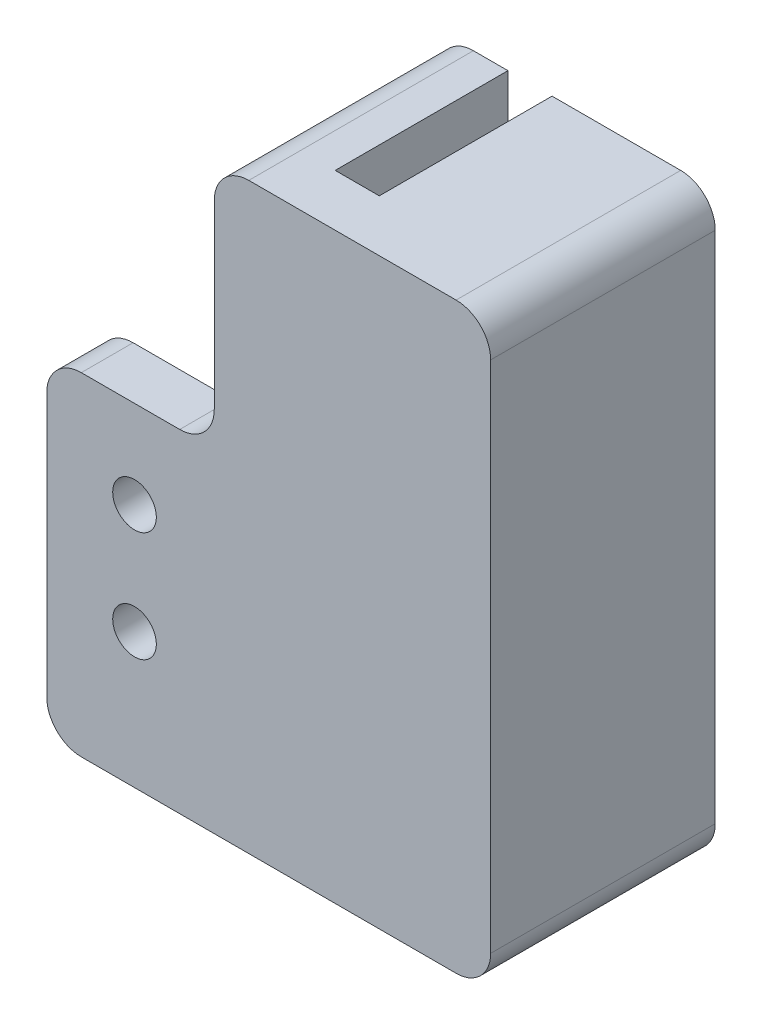
ISO-10303-21;
HEADER;
FILE_DESCRIPTION(('STEP AP214'),'2;1');
FILE_NAME('part.step','',(''),(''),'','','');
FILE_SCHEMA(('AUTOMOTIVE_DESIGN { 1 0 10303 214 1 1 1 1 }'));
ENDSEC;
DATA;
#1=APPLICATION_CONTEXT('core data for automotive mechanical design processes');
#2=APPLICATION_PROTOCOL_DEFINITION('international standard','automotive_design',2000,#1);
#3=PRODUCT_CONTEXT('',#1,'mechanical');
#4=PRODUCT('Part','Part','',(#3));
#5=PRODUCT_RELATED_PRODUCT_CATEGORY('part','',(#4));
#6=PRODUCT_DEFINITION_FORMATION('','',#4);
#7=PRODUCT_DEFINITION_CONTEXT('part definition',#1,'design');
#8=PRODUCT_DEFINITION('design','',#6,#7);
#9=PRODUCT_DEFINITION_SHAPE('','',#8);
#10=(LENGTH_UNIT() NAMED_UNIT(*) SI_UNIT(.MILLI.,.METRE.));
#11=(NAMED_UNIT(*) PLANE_ANGLE_UNIT() SI_UNIT($,.RADIAN.));
#12=(NAMED_UNIT(*) SI_UNIT($,.STERADIAN.) SOLID_ANGLE_UNIT());
#13=UNCERTAINTY_MEASURE_WITH_UNIT(LENGTH_MEASURE(1.E-05),#10,'distance_accuracy_value','');
#14=(GEOMETRIC_REPRESENTATION_CONTEXT(3) GLOBAL_UNCERTAINTY_ASSIGNED_CONTEXT((#13)) GLOBAL_UNIT_ASSIGNED_CONTEXT((#10,
#11,#12)) REPRESENTATION_CONTEXT('',''));
#15=CARTESIAN_POINT('',(0.,0.,0.));
#16=DIRECTION('',(0.,0.,1.));
#17=DIRECTION('',(1.,0.,0.));
#18=AXIS2_PLACEMENT_3D('',#15,#16,#17);
#19=CARTESIAN_POINT('',(0.,0.,20.));
#20=DIRECTION('',(0.,0.,-1.));
#21=DIRECTION('',(-1.,0.,0.));
#22=AXIS2_PLACEMENT_3D('',#19,#20,#21);
#23=PLANE('',#22);
#24=CARTESIAN_POINT('',(510.767604335457,28.3661978322714,20.));
#25=DIRECTION('',(0.,0.,-1.));
#26=DIRECTION('',(-1.,0.,0.));
#27=AXIS2_PLACEMENT_3D('',#24,#25,#26);
#28=CIRCLE('',#27,2.52499999999998);
#29=CARTESIAN_POINT('',(508.242604335457,28.3661978322714,20.));
#30=VERTEX_POINT('',#29);
#31=EDGE_CURVE('E256',#30,#30,#28,.T.);
#32=ORIENTED_EDGE('',*,*,#31,.F.);
#33=EDGE_LOOP('',(#32));
#34=FACE_BOUND('',#33,.T.);
#35=CARTESIAN_POINT('',(510.767604335457,15.6361978322714,20.));
#36=DIRECTION('',(0.,0.,-1.));
#37=DIRECTION('',(-1.,0.,0.));
#38=AXIS2_PLACEMENT_3D('',#35,#36,#37);
#39=CIRCLE('',#38,2.52499999999998);
#40=CARTESIAN_POINT('',(508.242604335457,15.6361978322714,20.));
#41=VERTEX_POINT('',#40);
#42=EDGE_CURVE('E251',#41,#41,#39,.T.);
#43=ORIENTED_EDGE('',*,*,#42,.F.);
#44=EDGE_LOOP('',(#43));
#45=FACE_BOUND('',#44,.T.);
#46=DIRECTION('',(-1.,0.,0.));
#47=VECTOR('',#46,1.);
#48=CARTESIAN_POINT('',(533.107604335457,0.,20.));
#49=LINE('',#48,#47);
#50=CARTESIAN_POINT('',(524.,0.,20.));
#51=VERTEX_POINT('',#50);
#52=CARTESIAN_POINT('',(504.607604335457,0.,20.));
#53=VERTEX_POINT('',#52);
#54=EDGE_CURVE('E267',#51,#53,#49,.T.);
#55=ORIENTED_EDGE('',*,*,#54,.T.);
#56=CARTESIAN_POINT('',(504.607604335457,4.,20.));
#57=DIRECTION('',(0.,0.,-1.));
#58=DIRECTION('',(-1.,0.,0.));
#59=AXIS2_PLACEMENT_3D('',#56,#57,#58);
#60=CIRCLE('',#59,4.);
#61=CARTESIAN_POINT('',(500.607604335457,4.,20.));
#62=VERTEX_POINT('',#61);
#63=EDGE_CURVE('E336',#53,#62,#60,.T.);
#64=ORIENTED_EDGE('',*,*,#63,.T.);
#65=DIRECTION('',(0.,1.,0.));
#66=VECTOR('',#65,1.);
#67=CARTESIAN_POINT('',(500.607604335457,67.5,20.));
#68=LINE('',#67,#66);
#69=CARTESIAN_POINT('',(500.607604335457,34.5261978322714,20.));
#70=VERTEX_POINT('',#69);
#71=EDGE_CURVE('E270',#62,#70,#68,.T.);
#72=ORIENTED_EDGE('',*,*,#71,.T.);
#73=CARTESIAN_POINT('',(504.607604335457,34.5261978322714,20.));
#74=DIRECTION('',(0.,0.,-1.));
#75=DIRECTION('',(-1.,0.,0.));
#76=AXIS2_PLACEMENT_3D('',#73,#74,#75);
#77=CIRCLE('',#76,4.);
#78=CARTESIAN_POINT('',(504.607604335457,38.5261978322714,20.));
#79=VERTEX_POINT('',#78);
#80=EDGE_CURVE('E286',#70,#79,#77,.T.);
#81=ORIENTED_EDGE('',*,*,#80,.T.);
#82=DIRECTION('',(1.,0.,0.));
#83=VECTOR('',#82,1.);
#84=CARTESIAN_POINT('',(516.,38.5261978322714,20.));
#85=LINE('',#84,#83);
#86=CARTESIAN_POINT('',(516.,38.5261978322714,20.));
#87=VERTEX_POINT('',#86);
#88=EDGE_CURVE('E284',#79,#87,#85,.T.);
#89=ORIENTED_EDGE('',*,*,#88,.T.);
#90=CARTESIAN_POINT('',(516.,42.5261978322714,20.));
#91=DIRECTION('',(0.,0.,-1.));
#92=DIRECTION('',(-1.,0.,0.));
#93=AXIS2_PLACEMENT_3D('',#90,#91,#92);
#94=CIRCLE('',#93,4.);
#95=CARTESIAN_POINT('',(520.,42.5261978322714,20.));
#96=VERTEX_POINT('',#95);
#97=EDGE_CURVE('E279',#87,#96,#94,.F.);
#98=ORIENTED_EDGE('',*,*,#97,.T.);
#99=DIRECTION('',(0.,1.,0.));
#100=VECTOR('',#99,1.);
#101=CARTESIAN_POINT('',(520.,67.5,20.));
#102=LINE('',#101,#100);
#103=CARTESIAN_POINT('',(520.,4.00000000000002,20.));
#104=VERTEX_POINT('',#103);
#105=EDGE_CURVE('E224',#104,#96,#102,.T.);
#106=ORIENTED_EDGE('',*,*,#105,.F.);
#107=CARTESIAN_POINT('',(524.,4.00000000000002,20.));
#108=DIRECTION('',(0.,0.,-1.));
#109=DIRECTION('',(-1.,0.,0.));
#110=AXIS2_PLACEMENT_3D('',#107,#108,#109);
#111=CIRCLE('',#110,4.);
#112=EDGE_CURVE('E11',#104,#51,#111,.F.);
#113=ORIENTED_EDGE('',*,*,#112,.T.);
#114=EDGE_LOOP('',(#55,#64,#72,#81,#89,#98,#106,#113));
#115=FACE_BOUND('',#114,.T.);
#116=ADVANCED_FACE('F39',(#34,#45,#115),#23,.T.);
#117=CARTESIAN_POINT('',(533.107604335457,0.,20.));
#118=VERTEX_POINT('',#117);
#119=CARTESIAN_POINT('',(528.,0.,20.));
#120=VERTEX_POINT('',#119);
#121=EDGE_CURVE('E268',#118,#120,#49,.T.);
#122=ORIENTED_EDGE('',*,*,#121,.T.);
#123=DIRECTION('',(0.,-1.,0.));
#124=VECTOR('',#123,1.);
#125=CARTESIAN_POINT('',(528.,67.5,20.));
#126=LINE('',#125,#124);
#127=CARTESIAN_POINT('',(528.,67.5,20.));
#128=VERTEX_POINT('',#127);
#129=EDGE_CURVE('E236',#128,#120,#126,.T.);
#130=ORIENTED_EDGE('',*,*,#129,.F.);
#131=DIRECTION('',(1.,0.,0.));
#132=VECTOR('',#131,1.);
#133=CARTESIAN_POINT('',(533.107604335457,67.5,20.));
#134=LINE('',#133,#132);
#135=CARTESIAN_POINT('',(533.107604335457,67.5,20.));
#136=VERTEX_POINT('',#135);
#137=EDGE_CURVE('E272',#128,#136,#134,.T.);
#138=ORIENTED_EDGE('',*,*,#137,.T.);
#139=DIRECTION('',(0.,-1.,0.));
#140=VECTOR('',#139,1.);
#141=CARTESIAN_POINT('',(533.107604335457,67.5,20.));
#142=LINE('',#141,#140);
#143=EDGE_CURVE('E264',#136,#118,#142,.T.);
#144=ORIENTED_EDGE('',*,*,#143,.T.);
#145=EDGE_LOOP('',(#122,#130,#138,#144));
#146=FACE_BOUND('',#145,.T.);
#147=ADVANCED_FACE('F422',(#146),#23,.T.);
#148=CARTESIAN_POINT('',(516.,42.5261978322714,26.));
#149=DIRECTION('',(0.,0.,-1.));
#150=DIRECTION('',(-1.,0.,0.));
#151=AXIS2_PLACEMENT_3D('',#148,#149,#150);
#152=CYLINDRICAL_SURFACE('',#151,4.);
#153=ORIENTED_EDGE('',*,*,#97,.F.);
#154=DIRECTION('',(0.,0.,-1.));
#155=VECTOR('',#154,1.);
#156=CARTESIAN_POINT('',(516.,38.5261978322714,26.));
#157=LINE('',#156,#155);
#158=CARTESIAN_POINT('',(516.,38.5261978322714,26.));
#159=VERTEX_POINT('',#158);
#160=EDGE_CURVE('E326',#159,#87,#157,.T.);
#161=ORIENTED_EDGE('',*,*,#160,.F.);
#162=CARTESIAN_POINT('',(516.,42.5261978322714,26.));
#163=DIRECTION('',(0.,0.,-1.));
#164=DIRECTION('',(1.,0.,0.));
#165=AXIS2_PLACEMENT_3D('',#162,#163,#164);
#166=CIRCLE('',#165,4.);
#167=CARTESIAN_POINT('',(520.,42.5261978322714,26.));
#168=VERTEX_POINT('',#167);
#169=EDGE_CURVE('E289',#168,#159,#166,.T.);
#170=ORIENTED_EDGE('',*,*,#169,.F.);
#171=DIRECTION('',(0.,0.,-1.));
#172=VECTOR('',#171,1.);
#173=CARTESIAN_POINT('',(520.,42.5261978322714,26.));
#174=LINE('',#173,#172);
#175=EDGE_CURVE('E311',#168,#96,#174,.T.);
#176=ORIENTED_EDGE('',*,*,#175,.T.);
#177=EDGE_LOOP('',(#153,#161,#170,#176));
#178=FACE_BOUND('',#177,.T.);
#179=ADVANCED_FACE('F388',(#178),#152,.F.);
#180=CARTESIAN_POINT('',(516.,38.5261978322714,26.));
#181=DIRECTION('',(0.,-1.,0.));
#182=DIRECTION('',(0.,0.,-1.));
#183=AXIS2_PLACEMENT_3D('',#180,#181,#182);
#184=PLANE('',#183);
#185=ORIENTED_EDGE('',*,*,#88,.F.);
#186=DIRECTION('',(0.,0.,-1.));
#187=VECTOR('',#186,1.);
#188=CARTESIAN_POINT('',(504.607604335457,38.5261978322714,26.));
#189=LINE('',#188,#187);
#190=CARTESIAN_POINT('',(504.607604335457,38.5261978322714,26.));
#191=VERTEX_POINT('',#190);
#192=EDGE_CURVE('E323',#191,#79,#189,.T.);
#193=ORIENTED_EDGE('',*,*,#192,.F.);
#194=DIRECTION('',(-1.,0.,0.));
#195=VECTOR('',#194,1.);
#196=CARTESIAN_POINT('',(516.,38.5261978322714,26.));
#197=LINE('',#196,#195);
#198=EDGE_CURVE('E292',#159,#191,#197,.T.);
#199=ORIENTED_EDGE('',*,*,#198,.F.);
#200=ORIENTED_EDGE('',*,*,#160,.T.);
#201=EDGE_LOOP('',(#185,#193,#199,#200));
#202=FACE_BOUND('',#201,.T.);
#203=ADVANCED_FACE('F394',(#202),#184,.F.);
#204=CARTESIAN_POINT('',(504.607604335457,34.5261978322714,26.));
#205=DIRECTION('',(0.,0.,-1.));
#206=DIRECTION('',(-1.,0.,0.));
#207=AXIS2_PLACEMENT_3D('',#204,#205,#206);
#208=CYLINDRICAL_SURFACE('',#207,4.);
#209=ORIENTED_EDGE('',*,*,#80,.F.);
#210=DIRECTION('',(0.,0.,-1.));
#211=VECTOR('',#210,1.);
#212=CARTESIAN_POINT('',(500.607604335457,34.5261978322714,26.));
#213=LINE('',#212,#211);
#214=CARTESIAN_POINT('',(500.607604335457,34.5261978322714,26.));
#215=VERTEX_POINT('',#214);
#216=EDGE_CURVE('E320',#215,#70,#213,.T.);
#217=ORIENTED_EDGE('',*,*,#216,.F.);
#218=CARTESIAN_POINT('',(504.607604335457,34.5261978322714,26.));
#219=DIRECTION('',(0.,0.,1.));
#220=DIRECTION('',(1.,0.,0.));
#221=AXIS2_PLACEMENT_3D('',#218,#219,#220);
#222=CIRCLE('',#221,4.);
#223=EDGE_CURVE('E295',#191,#215,#222,.T.);
#224=ORIENTED_EDGE('',*,*,#223,.F.);
#225=ORIENTED_EDGE('',*,*,#192,.T.);
#226=EDGE_LOOP('',(#209,#217,#224,#225));
#227=FACE_BOUND('',#226,.T.);
#228=ADVANCED_FACE('F397',(#227),#208,.T.);
#229=CARTESIAN_POINT('',(500.607604335457,24.,26.));
#230=DIRECTION('',(1.,0.,0.));
#231=DIRECTION('',(0.,0.,-1.));
#232=AXIS2_PLACEMENT_3D('',#229,#230,#231);
#233=PLANE('',#232);
#234=ORIENTED_EDGE('',*,*,#71,.F.);
#235=DIRECTION('',(0.,0.,-1.));
#236=VECTOR('',#235,1.);
#237=CARTESIAN_POINT('',(500.607604335457,4.,26.));
#238=LINE('',#237,#236);
#239=CARTESIAN_POINT('',(500.607604335457,4.,26.));
#240=VERTEX_POINT('',#239);
#241=EDGE_CURVE('E338',#62,#240,#238,.F.);
#242=ORIENTED_EDGE('',*,*,#241,.T.);
#243=DIRECTION('',(0.,-1.,0.));
#244=VECTOR('',#243,1.);
#245=CARTESIAN_POINT('',(500.607604335457,34.5261978322714,26.));
#246=LINE('',#245,#244);
#247=EDGE_CURVE('E297',#215,#240,#246,.T.);
#248=ORIENTED_EDGE('',*,*,#247,.F.);
#249=ORIENTED_EDGE('',*,*,#216,.T.);
#250=EDGE_LOOP('',(#234,#242,#248,#249));
#251=FACE_BOUND('',#250,.T.);
#252=ADVANCED_FACE('F401',(#251),#233,.F.);
#253=CARTESIAN_POINT('',(520.,67.5,26.));
#254=DIRECTION('',(1.,0.,0.));
#255=DIRECTION('',(0.,0.,-1.));
#256=AXIS2_PLACEMENT_3D('',#253,#254,#255);
#257=PLANE('',#256);
#258=DIRECTION('',(0.,-1.,0.));
#259=VECTOR('',#258,1.);
#260=CARTESIAN_POINT('',(520.,67.5,26.));
#261=LINE('',#260,#259);
#262=CARTESIAN_POINT('',(520.,63.5,26.));
#263=VERTEX_POINT('',#262);
#264=EDGE_CURVE('E309',#263,#168,#261,.T.);
#265=ORIENTED_EDGE('',*,*,#264,.F.);
#266=DIRECTION('',(0.,0.,-1.));
#267=VECTOR('',#266,1.);
#268=CARTESIAN_POINT('',(520.,63.5,26.));
#269=LINE('',#268,#267);
#270=CARTESIAN_POINT('',(520.,63.5,0.));
#271=VERTEX_POINT('',#270);
#272=EDGE_CURVE('E365',#263,#271,#269,.T.);
#273=ORIENTED_EDGE('',*,*,#272,.T.);
#274=DIRECTION('',(0.,1.,0.));
#275=VECTOR('',#274,1.);
#276=CARTESIAN_POINT('',(520.,67.5,0.));
#277=LINE('',#276,#275);
#278=CARTESIAN_POINT('',(520.,4.00000000000002,0.));
#279=VERTEX_POINT('',#278);
#280=EDGE_CURVE('E233',#279,#271,#277,.T.);
#281=ORIENTED_EDGE('',*,*,#280,.F.);
#282=DIRECTION('',(0.,0.,1.));
#283=VECTOR('',#282,1.);
#284=CARTESIAN_POINT('',(520.,4.00000000000002,26.));
#285=LINE('',#284,#283);
#286=EDGE_CURVE('E362',#279,#104,#285,.T.);
#287=ORIENTED_EDGE('',*,*,#286,.T.);
#288=ORIENTED_EDGE('',*,*,#105,.T.);
#289=ORIENTED_EDGE('',*,*,#175,.F.);
#290=EDGE_LOOP('',(#265,#273,#281,#287,#288,#289));
#291=FACE_BOUND('',#290,.T.);
#292=ADVANCED_FACE('F382',(#291),#257,.F.);
#293=CARTESIAN_POINT('',(516.,0.,26.));
#294=DIRECTION('',(0.,1.,0.));
#295=DIRECTION('',(-1.,0.,0.));
#296=AXIS2_PLACEMENT_3D('',#293,#294,#295);
#297=PLANE('',#296);
#298=DIRECTION('',(1.,0.,0.));
#299=VECTOR('',#298,1.);
#300=CARTESIAN_POINT('',(500.607604335457,0.,26.));
#301=LINE('',#300,#299);
#302=CARTESIAN_POINT('',(504.607604335457,0.,26.));
#303=VERTEX_POINT('',#302);
#304=CARTESIAN_POINT('',(548.,0.,26.));
#305=VERTEX_POINT('',#304);
#306=EDGE_CURVE('E300',#303,#305,#301,.T.);
#307=ORIENTED_EDGE('',*,*,#306,.F.);
#308=DIRECTION('',(0.,0.,-1.));
#309=VECTOR('',#308,1.);
#310=CARTESIAN_POINT('',(504.607604335457,0.,26.));
#311=LINE('',#310,#309);
#312=EDGE_CURVE('E333',#303,#53,#311,.T.);
#313=ORIENTED_EDGE('',*,*,#312,.T.);
#314=ORIENTED_EDGE('',*,*,#54,.F.);
#315=DIRECTION('',(0.,0.,1.));
#316=VECTOR('',#315,1.);
#317=CARTESIAN_POINT('',(524.,0.,26.));
#318=LINE('',#317,#316);
#319=CARTESIAN_POINT('',(524.,0.,0.));
#320=VERTEX_POINT('',#319);
#321=EDGE_CURVE('E329',#51,#320,#318,.F.);
#322=ORIENTED_EDGE('',*,*,#321,.T.);
#323=DIRECTION('',(-1.,0.,0.));
#324=VECTOR('',#323,1.);
#325=CARTESIAN_POINT('',(520.,0.,0.));
#326=LINE('',#325,#324);
#327=CARTESIAN_POINT('',(528.,0.,0.));
#328=VERTEX_POINT('',#327);
#329=EDGE_CURVE('E240',#328,#320,#326,.T.);
#330=ORIENTED_EDGE('',*,*,#329,.F.);
#331=DIRECTION('',(0.,0.,1.));
#332=VECTOR('',#331,1.);
#333=CARTESIAN_POINT('',(528.,0.,0.));
#334=LINE('',#333,#332);
#335=EDGE_CURVE('E242',#328,#120,#334,.T.);
#336=ORIENTED_EDGE('',*,*,#335,.T.);
#337=ORIENTED_EDGE('',*,*,#121,.F.);
#338=DIRECTION('',(0.,0.,-1.));
#339=VECTOR('',#338,1.);
#340=CARTESIAN_POINT('',(533.107604335457,0.,20.));
#341=LINE('',#340,#339);
#342=CARTESIAN_POINT('',(533.107604335457,0.,0.));
#343=VERTEX_POINT('',#342);
#344=EDGE_CURVE('E274',#118,#343,#341,.T.);
#345=ORIENTED_EDGE('',*,*,#344,.T.);
#346=DIRECTION('',(1.,0.,0.));
#347=VECTOR('',#346,1.);
#348=CARTESIAN_POINT('',(516.,0.,0.));
#349=LINE('',#348,#347);
#350=CARTESIAN_POINT('',(548.,0.,0.));
#351=VERTEX_POINT('',#350);
#352=EDGE_CURVE('E288',#343,#351,#349,.T.);
#353=ORIENTED_EDGE('',*,*,#352,.T.);
#354=DIRECTION('',(0.,0.,-1.));
#355=VECTOR('',#354,1.);
#356=CARTESIAN_POINT('',(548.,0.,26.));
#357=LINE('',#356,#355);
#358=EDGE_CURVE('E331',#351,#305,#357,.F.);
#359=ORIENTED_EDGE('',*,*,#358,.T.);
#360=EDGE_LOOP('',(#307,#313,#314,#322,#330,#336,#337,#345,#353,#359));
#361=FACE_BOUND('',#360,.T.);
#362=ADVANCED_FACE('F410',(#361),#297,.F.);
#363=CARTESIAN_POINT('',(552.,67.5,26.));
#364=DIRECTION('',(-1.,0.,0.));
#365=DIRECTION('',(0.,0.,1.));
#366=AXIS2_PLACEMENT_3D('',#363,#364,#365);
#367=PLANE('',#366);
#368=DIRECTION('',(0.,1.,0.));
#369=VECTOR('',#368,1.);
#370=CARTESIAN_POINT('',(552.,67.5,0.));
#371=LINE('',#370,#369);
#372=CARTESIAN_POINT('',(552.,4.00000000000003,0.));
#373=VERTEX_POINT('',#372);
#374=CARTESIAN_POINT('',(552.,63.5,0.));
#375=VERTEX_POINT('',#374);
#376=EDGE_CURVE('E314',#373,#375,#371,.T.);
#377=ORIENTED_EDGE('',*,*,#376,.T.);
#378=DIRECTION('',(0.,0.,-1.));
#379=VECTOR('',#378,1.);
#380=CARTESIAN_POINT('',(552.,63.5,26.));
#381=LINE('',#380,#379);
#382=CARTESIAN_POINT('',(552.,63.5,26.));
#383=VERTEX_POINT('',#382);
#384=EDGE_CURVE('E360',#375,#383,#381,.F.);
#385=ORIENTED_EDGE('',*,*,#384,.T.);
#386=DIRECTION('',(0.,1.,0.));
#387=VECTOR('',#386,1.);
#388=CARTESIAN_POINT('',(552.,0.,26.));
#389=LINE('',#388,#387);
#390=CARTESIAN_POINT('',(552.,4.,26.));
#391=VERTEX_POINT('',#390);
#392=EDGE_CURVE('E303',#391,#383,#389,.T.);
#393=ORIENTED_EDGE('',*,*,#392,.F.);
#394=DIRECTION('',(0.,0.,-1.));
#395=VECTOR('',#394,1.);
#396=CARTESIAN_POINT('',(552.,4.,26.));
#397=LINE('',#396,#395);
#398=EDGE_CURVE('E357',#391,#373,#397,.T.);
#399=ORIENTED_EDGE('',*,*,#398,.T.);
#400=EDGE_LOOP('',(#377,#385,#393,#399));
#401=FACE_BOUND('',#400,.T.);
#402=ADVANCED_FACE('F441',(#401),#367,.F.);
#403=CARTESIAN_POINT('',(520.,67.5,26.));
#404=DIRECTION('',(0.,-1.,0.));
#405=DIRECTION('',(0.,0.,-1.));
#406=AXIS2_PLACEMENT_3D('',#403,#404,#405);
#407=PLANE('',#406);
#408=DIRECTION('',(-1.,0.,0.));
#409=VECTOR('',#408,1.);
#410=CARTESIAN_POINT('',(520.,67.5,26.));
#411=LINE('',#410,#409);
#412=CARTESIAN_POINT('',(548.,67.5,26.));
#413=VERTEX_POINT('',#412);
#414=CARTESIAN_POINT('',(524.,67.5,26.));
#415=VERTEX_POINT('',#414);
#416=EDGE_CURVE('E306',#413,#415,#411,.T.);
#417=ORIENTED_EDGE('',*,*,#416,.F.);
#418=DIRECTION('',(0.,0.,-1.));
#419=VECTOR('',#418,1.);
#420=CARTESIAN_POINT('',(548.,67.5,26.));
#421=LINE('',#420,#419);
#422=CARTESIAN_POINT('',(548.,67.5,0.));
#423=VERTEX_POINT('',#422);
#424=EDGE_CURVE('E350',#413,#423,#421,.T.);
#425=ORIENTED_EDGE('',*,*,#424,.T.);
#426=DIRECTION('',(-1.,0.,0.));
#427=VECTOR('',#426,1.);
#428=CARTESIAN_POINT('',(520.,67.5,0.));
#429=LINE('',#428,#427);
#430=CARTESIAN_POINT('',(533.107604335457,67.5,0.));
#431=VERTEX_POINT('',#430);
#432=EDGE_CURVE('E293',#423,#431,#429,.T.);
#433=ORIENTED_EDGE('',*,*,#432,.T.);
#434=DIRECTION('',(0.,0.,-1.));
#435=VECTOR('',#434,1.);
#436=CARTESIAN_POINT('',(533.107604335457,67.5,20.));
#437=LINE('',#436,#435);
#438=EDGE_CURVE('E276',#136,#431,#437,.T.);
#439=ORIENTED_EDGE('',*,*,#438,.F.);
#440=ORIENTED_EDGE('',*,*,#137,.F.);
#441=DIRECTION('',(0.,0.,1.));
#442=VECTOR('',#441,1.);
#443=CARTESIAN_POINT('',(528.,67.5,0.));
#444=LINE('',#443,#442);
#445=CARTESIAN_POINT('',(528.,67.5,0.));
#446=VERTEX_POINT('',#445);
#447=EDGE_CURVE('E248',#446,#128,#444,.T.);
#448=ORIENTED_EDGE('',*,*,#447,.F.);
#449=DIRECTION('',(1.,0.,0.));
#450=VECTOR('',#449,1.);
#451=CARTESIAN_POINT('',(520.,67.5,0.));
#452=LINE('',#451,#450);
#453=CARTESIAN_POINT('',(524.,67.5,0.));
#454=VERTEX_POINT('',#453);
#455=EDGE_CURVE('E235',#454,#446,#452,.T.);
#456=ORIENTED_EDGE('',*,*,#455,.F.);
#457=DIRECTION('',(0.,0.,-1.));
#458=VECTOR('',#457,1.);
#459=CARTESIAN_POINT('',(524.,67.5,26.));
#460=LINE('',#459,#458);
#461=EDGE_CURVE('E348',#454,#415,#460,.F.);
#462=ORIENTED_EDGE('',*,*,#461,.T.);
#463=EDGE_LOOP('',(#417,#425,#433,#439,#440,#448,#456,#462));
#464=FACE_BOUND('',#463,.T.);
#465=ADVANCED_FACE('F372',(#464),#407,.F.);
#466=CARTESIAN_POINT('',(516.,42.5261978322714,26.));
#467=DIRECTION('',(0.,0.,1.));
#468=DIRECTION('',(1.,0.,0.));
#469=AXIS2_PLACEMENT_3D('',#466,#467,#468);
#470=PLANE('',#469);
#471=CARTESIAN_POINT('',(510.767604335457,28.3661978322714,26.));
#472=DIRECTION('',(0.,0.,-1.));
#473=DIRECTION('',(-1.,0.,0.));
#474=AXIS2_PLACEMENT_3D('',#471,#472,#473);
#475=CIRCLE('',#474,2.52499999999998);
#476=CARTESIAN_POINT('',(508.242604335457,28.3661978322714,26.));
#477=VERTEX_POINT('',#476);
#478=EDGE_CURVE('E252',#477,#477,#475,.T.);
#479=ORIENTED_EDGE('',*,*,#478,.T.);
#480=EDGE_LOOP('',(#479));
#481=FACE_BOUND('',#480,.T.);
#482=CARTESIAN_POINT('',(510.767604335457,15.6361978322714,26.));
#483=DIRECTION('',(0.,0.,-1.));
#484=DIRECTION('',(-1.,0.,0.));
#485=AXIS2_PLACEMENT_3D('',#482,#483,#484);
#486=CIRCLE('',#485,2.52499999999998);
#487=CARTESIAN_POINT('',(508.242604335457,15.6361978322714,26.));
#488=VERTEX_POINT('',#487);
#489=EDGE_CURVE('E259',#488,#488,#486,.T.);
#490=ORIENTED_EDGE('',*,*,#489,.T.);
#491=EDGE_LOOP('',(#490));
#492=FACE_BOUND('',#491,.T.);
#493=ORIENTED_EDGE('',*,*,#247,.T.);
#494=CARTESIAN_POINT('',(504.607604335457,4.,26.));
#495=DIRECTION('',(0.,0.,1.));
#496=DIRECTION('',(1.,0.,0.));
#497=AXIS2_PLACEMENT_3D('',#494,#495,#496);
#498=CIRCLE('',#497,4.);
#499=EDGE_CURVE('E346',#240,#303,#498,.T.);
#500=ORIENTED_EDGE('',*,*,#499,.T.);
#501=ORIENTED_EDGE('',*,*,#306,.T.);
#502=CARTESIAN_POINT('',(548.,4.,26.));
#503=DIRECTION('',(0.,0.,1.));
#504=DIRECTION('',(1.,0.,0.));
#505=AXIS2_PLACEMENT_3D('',#502,#503,#504);
#506=CIRCLE('',#505,4.);
#507=EDGE_CURVE('E340',#305,#391,#506,.T.);
#508=ORIENTED_EDGE('',*,*,#507,.T.);
#509=ORIENTED_EDGE('',*,*,#392,.T.);
#510=CARTESIAN_POINT('',(548.,63.5,26.));
#511=DIRECTION('',(0.,0.,1.));
#512=DIRECTION('',(1.,0.,0.));
#513=AXIS2_PLACEMENT_3D('',#510,#511,#512);
#514=CIRCLE('',#513,4.);
#515=EDGE_CURVE('E344',#383,#413,#514,.T.);
#516=ORIENTED_EDGE('',*,*,#515,.T.);
#517=ORIENTED_EDGE('',*,*,#416,.T.);
#518=CARTESIAN_POINT('',(524.,63.5,26.));
#519=DIRECTION('',(0.,0.,1.));
#520=DIRECTION('',(1.,0.,0.));
#521=AXIS2_PLACEMENT_3D('',#518,#519,#520);
#522=CIRCLE('',#521,4.);
#523=EDGE_CURVE('E342',#415,#263,#522,.T.);
#524=ORIENTED_EDGE('',*,*,#523,.T.);
#525=ORIENTED_EDGE('',*,*,#264,.T.);
#526=ORIENTED_EDGE('',*,*,#169,.T.);
#527=ORIENTED_EDGE('',*,*,#198,.T.);
#528=ORIENTED_EDGE('',*,*,#223,.T.);
#529=EDGE_LOOP('',(#493,#500,#501,#508,#509,#516,#517,#524,#525,#526,#527,#528));
#530=FACE_BOUND('',#529,.T.);
#531=ADVANCED_FACE('F379',(#481,#492,#530),#470,.T.);
#532=CARTESIAN_POINT('',(516.,42.5261978322714,0.));
#533=DIRECTION('',(0.,0.,1.));
#534=DIRECTION('',(1.,0.,0.));
#535=AXIS2_PLACEMENT_3D('',#532,#533,#534);
#536=PLANE('',#535);
#537=CARTESIAN_POINT('',(548.5,57.5,0.));
#538=DIRECTION('',(0.,0.,-1.));
#539=DIRECTION('',(-1.,0.,0.));
#540=AXIS2_PLACEMENT_3D('',#537,#538,#539);
#541=CIRCLE('',#540,1.525);
#542=CARTESIAN_POINT('',(546.975,57.5,0.));
#543=VERTEX_POINT('',#542);
#544=EDGE_CURVE('E186',#543,#543,#541,.T.);
#545=ORIENTED_EDGE('',*,*,#544,.F.);
#546=EDGE_LOOP('',(#545));
#547=FACE_BOUND('',#546,.T.);
#548=CARTESIAN_POINT('',(548.5,22.5,0.));
#549=DIRECTION('',(0.,0.,-1.));
#550=DIRECTION('',(-1.,0.,0.));
#551=AXIS2_PLACEMENT_3D('',#548,#549,#550);
#552=CIRCLE('',#551,1.525);
#553=CARTESIAN_POINT('',(546.975,22.5,0.));
#554=VERTEX_POINT('',#553);
#555=EDGE_CURVE('E202',#554,#554,#552,.T.);
#556=ORIENTED_EDGE('',*,*,#555,.F.);
#557=EDGE_LOOP('',(#556));
#558=FACE_BOUND('',#557,.T.);
#559=CARTESIAN_POINT('',(548.5,5.,0.));
#560=DIRECTION('',(0.,0.,-1.));
#561=DIRECTION('',(-1.,0.,0.));
#562=AXIS2_PLACEMENT_3D('',#559,#560,#561);
#563=CIRCLE('',#562,3.24999999999995);
#564=CARTESIAN_POINT('',(545.25,5.,0.));
#565=VERTEX_POINT('',#564);
#566=EDGE_CURVE('E220',#565,#565,#563,.T.);
#567=ORIENTED_EDGE('',*,*,#566,.F.);
#568=EDGE_LOOP('',(#567));
#569=FACE_BOUND('',#568,.T.);
#570=ORIENTED_EDGE('',*,*,#432,.F.);
#571=CARTESIAN_POINT('',(548.,63.5,0.));
#572=DIRECTION('',(0.,0.,1.));
#573=DIRECTION('',(1.,0.,0.));
#574=AXIS2_PLACEMENT_3D('',#571,#572,#573);
#575=CIRCLE('',#574,4.);
#576=EDGE_CURVE('E355',#423,#375,#575,.F.);
#577=ORIENTED_EDGE('',*,*,#576,.T.);
#578=ORIENTED_EDGE('',*,*,#376,.F.);
#579=CARTESIAN_POINT('',(548.,4.,0.));
#580=DIRECTION('',(0.,0.,1.));
#581=DIRECTION('',(1.,0.,0.));
#582=AXIS2_PLACEMENT_3D('',#579,#580,#581);
#583=CIRCLE('',#582,4.);
#584=EDGE_CURVE('E353',#373,#351,#583,.F.);
#585=ORIENTED_EDGE('',*,*,#584,.T.);
#586=ORIENTED_EDGE('',*,*,#352,.F.);
#587=DIRECTION('',(0.,-1.,0.));
#588=VECTOR('',#587,1.);
#589=CARTESIAN_POINT('',(533.107604335457,67.5,0.));
#590=LINE('',#589,#588);
#591=EDGE_CURVE('E255',#431,#343,#590,.T.);
#592=ORIENTED_EDGE('',*,*,#591,.F.);
#593=EDGE_LOOP('',(#570,#577,#578,#585,#586,#592));
#594=FACE_BOUND('',#593,.T.);
#595=ADVANCED_FACE('F431',(#547,#558,#569,#594),#536,.F.);
#596=CARTESIAN_POINT('',(533.107604335457,67.5,20.));
#597=DIRECTION('',(1.,0.,0.));
#598=DIRECTION('',(0.,0.,-1.));
#599=AXIS2_PLACEMENT_3D('',#596,#597,#598);
#600=PLANE('',#599);
#601=ORIENTED_EDGE('',*,*,#591,.T.);
#602=ORIENTED_EDGE('',*,*,#344,.F.);
#603=ORIENTED_EDGE('',*,*,#143,.F.);
#604=ORIENTED_EDGE('',*,*,#438,.T.);
#605=EDGE_LOOP('',(#601,#602,#603,#604));
#606=FACE_BOUND('',#605,.T.);
#607=ADVANCED_FACE('F426',(#606),#600,.F.);
#608=CARTESIAN_POINT('',(510.767604335457,15.6361978322714,26.));
#609=DIRECTION('',(0.,0.,-1.));
#610=DIRECTION('',(-1.,0.,0.));
#611=AXIS2_PLACEMENT_3D('',#608,#609,#610);
#612=CYLINDRICAL_SURFACE('',#611,2.52499999999998);
#613=ORIENTED_EDGE('',*,*,#489,.F.);
#614=EDGE_LOOP('',(#613));
#615=FACE_BOUND('',#614,.T.);
#616=ORIENTED_EDGE('',*,*,#42,.T.);
#617=EDGE_LOOP('',(#616));
#618=FACE_BOUND('',#617,.T.);
#619=ADVANCED_FACE('F463',(#615,#618),#612,.F.);
#620=CARTESIAN_POINT('',(510.767604335457,28.3661978322714,26.));
#621=DIRECTION('',(0.,0.,-1.));
#622=DIRECTION('',(-1.,0.,0.));
#623=AXIS2_PLACEMENT_3D('',#620,#621,#622);
#624=CYLINDRICAL_SURFACE('',#623,2.52499999999998);
#625=ORIENTED_EDGE('',*,*,#478,.F.);
#626=EDGE_LOOP('',(#625));
#627=FACE_BOUND('',#626,.T.);
#628=ORIENTED_EDGE('',*,*,#31,.T.);
#629=EDGE_LOOP('',(#628));
#630=FACE_BOUND('',#629,.T.);
#631=ADVANCED_FACE('F542',(#627,#630),#624,.F.);
#632=CARTESIAN_POINT('',(528.,67.5,0.));
#633=DIRECTION('',(-1.,0.,0.));
#634=DIRECTION('',(0.,0.,1.));
#635=AXIS2_PLACEMENT_3D('',#632,#633,#634);
#636=PLANE('',#635);
#637=ORIENTED_EDGE('',*,*,#129,.T.);
#638=ORIENTED_EDGE('',*,*,#335,.F.);
#639=DIRECTION('',(0.,-1.,0.));
#640=VECTOR('',#639,1.);
#641=CARTESIAN_POINT('',(528.,67.5,0.));
#642=LINE('',#641,#640);
#643=EDGE_CURVE('E238',#446,#328,#642,.T.);
#644=ORIENTED_EDGE('',*,*,#643,.F.);
#645=ORIENTED_EDGE('',*,*,#447,.T.);
#646=EDGE_LOOP('',(#637,#638,#644,#645));
#647=FACE_BOUND('',#646,.T.);
#648=ADVANCED_FACE('F418',(#647),#636,.F.);
#649=CARTESIAN_POINT('',(0.,0.,0.));
#650=DIRECTION('',(0.,0.,1.));
#651=DIRECTION('',(1.,0.,0.));
#652=AXIS2_PLACEMENT_3D('',#649,#650,#651);
#653=PLANE('',#652);
#654=CARTESIAN_POINT('',(523.5,57.5,0.));
#655=DIRECTION('',(0.,0.,-1.));
#656=DIRECTION('',(-1.,0.,0.));
#657=AXIS2_PLACEMENT_3D('',#654,#655,#656);
#658=CIRCLE('',#657,1.525);
#659=CARTESIAN_POINT('',(521.975,57.5,0.));
#660=VERTEX_POINT('',#659);
#661=EDGE_CURVE('E193',#660,#660,#658,.T.);
#662=ORIENTED_EDGE('',*,*,#661,.F.);
#663=EDGE_LOOP('',(#662));
#664=FACE_BOUND('',#663,.T.);
#665=CARTESIAN_POINT('',(523.5,22.5,0.));
#666=DIRECTION('',(0.,0.,-1.));
#667=DIRECTION('',(-1.,0.,0.));
#668=AXIS2_PLACEMENT_3D('',#665,#666,#667);
#669=CIRCLE('',#668,1.525);
#670=CARTESIAN_POINT('',(521.975,22.5,0.));
#671=VERTEX_POINT('',#670);
#672=EDGE_CURVE('E211',#671,#671,#669,.T.);
#673=ORIENTED_EDGE('',*,*,#672,.F.);
#674=EDGE_LOOP('',(#673));
#675=FACE_BOUND('',#674,.T.);
#676=CARTESIAN_POINT('',(523.5,5.,0.));
#677=DIRECTION('',(0.,0.,-1.));
#678=DIRECTION('',(-1.,0.,0.));
#679=AXIS2_PLACEMENT_3D('',#676,#677,#678);
#680=CIRCLE('',#679,3.24999999999995);
#681=CARTESIAN_POINT('',(520.25,5.,0.));
#682=VERTEX_POINT('',#681);
#683=EDGE_CURVE('E225',#682,#682,#680,.T.);
#684=ORIENTED_EDGE('',*,*,#683,.F.);
#685=EDGE_LOOP('',(#684));
#686=FACE_BOUND('',#685,.T.);
#687=ORIENTED_EDGE('',*,*,#280,.T.);
#688=CARTESIAN_POINT('',(524.,63.5,0.));
#689=DIRECTION('',(0.,0.,1.));
#690=DIRECTION('',(1.,0.,0.));
#691=AXIS2_PLACEMENT_3D('',#688,#689,#690);
#692=CIRCLE('',#691,4.);
#693=EDGE_CURVE('E47',#271,#454,#692,.F.);
#694=ORIENTED_EDGE('',*,*,#693,.T.);
#695=ORIENTED_EDGE('',*,*,#455,.T.);
#696=ORIENTED_EDGE('',*,*,#643,.T.);
#697=ORIENTED_EDGE('',*,*,#329,.T.);
#698=CARTESIAN_POINT('',(524.,4.00000000000002,0.));
#699=DIRECTION('',(0.,0.,1.));
#700=DIRECTION('',(1.,0.,0.));
#701=AXIS2_PLACEMENT_3D('',#698,#699,#700);
#702=CIRCLE('',#701,4.);
#703=EDGE_CURVE('E61',#320,#279,#702,.F.);
#704=ORIENTED_EDGE('',*,*,#703,.T.);
#705=EDGE_LOOP('',(#687,#694,#695,#696,#697,#704));
#706=FACE_BOUND('',#705,.T.);
#707=ADVANCED_FACE('F368',(#664,#675,#686,#706),#653,.F.);
#708=CARTESIAN_POINT('',(504.607604335457,4.,26.));
#709=DIRECTION('',(0.,0.,-1.));
#710=DIRECTION('',(-1.,0.,0.));
#711=AXIS2_PLACEMENT_3D('',#708,#709,#710);
#712=CYLINDRICAL_SURFACE('',#711,4.);
#713=ORIENTED_EDGE('',*,*,#499,.F.);
#714=ORIENTED_EDGE('',*,*,#241,.F.);
#715=ORIENTED_EDGE('',*,*,#63,.F.);
#716=ORIENTED_EDGE('',*,*,#312,.F.);
#717=EDGE_LOOP('',(#713,#714,#715,#716));
#718=FACE_BOUND('',#717,.T.);
#719=ADVANCED_FACE('F407',(#718),#712,.T.);
#720=CARTESIAN_POINT('',(548.,63.5,26.));
#721=DIRECTION('',(0.,0.,-1.));
#722=DIRECTION('',(-1.,0.,0.));
#723=AXIS2_PLACEMENT_3D('',#720,#721,#722);
#724=CYLINDRICAL_SURFACE('',#723,4.);
#725=ORIENTED_EDGE('',*,*,#515,.F.);
#726=ORIENTED_EDGE('',*,*,#384,.F.);
#727=ORIENTED_EDGE('',*,*,#576,.F.);
#728=ORIENTED_EDGE('',*,*,#424,.F.);
#729=EDGE_LOOP('',(#725,#726,#727,#728));
#730=FACE_BOUND('',#729,.T.);
#731=ADVANCED_FACE('F444',(#730),#724,.T.);
#732=CARTESIAN_POINT('',(524.,63.5,26.));
#733=DIRECTION('',(0.,0.,-1.));
#734=DIRECTION('',(-1.,0.,0.));
#735=AXIS2_PLACEMENT_3D('',#732,#733,#734);
#736=CYLINDRICAL_SURFACE('',#735,4.);
#737=ORIENTED_EDGE('',*,*,#523,.F.);
#738=ORIENTED_EDGE('',*,*,#461,.F.);
#739=ORIENTED_EDGE('',*,*,#693,.F.);
#740=ORIENTED_EDGE('',*,*,#272,.F.);
#741=EDGE_LOOP('',(#737,#738,#739,#740));
#742=FACE_BOUND('',#741,.T.);
#743=ADVANCED_FACE('F376',(#742),#736,.T.);
#744=CARTESIAN_POINT('',(548.,4.,26.));
#745=DIRECTION('',(0.,0.,-1.));
#746=DIRECTION('',(-1.,0.,0.));
#747=AXIS2_PLACEMENT_3D('',#744,#745,#746);
#748=CYLINDRICAL_SURFACE('',#747,4.);
#749=ORIENTED_EDGE('',*,*,#507,.F.);
#750=ORIENTED_EDGE('',*,*,#358,.F.);
#751=ORIENTED_EDGE('',*,*,#584,.F.);
#752=ORIENTED_EDGE('',*,*,#398,.F.);
#753=EDGE_LOOP('',(#749,#750,#751,#752));
#754=FACE_BOUND('',#753,.T.);
#755=ADVANCED_FACE('F436',(#754),#748,.T.);
#756=CARTESIAN_POINT('',(524.,4.00000000000002,26.));
#757=DIRECTION('',(0.,0.,1.));
#758=DIRECTION('',(1.,0.,0.));
#759=AXIS2_PLACEMENT_3D('',#756,#757,#758);
#760=CYLINDRICAL_SURFACE('',#759,4.);
#761=ORIENTED_EDGE('',*,*,#703,.F.);
#762=ORIENTED_EDGE('',*,*,#321,.F.);
#763=ORIENTED_EDGE('',*,*,#112,.F.);
#764=ORIENTED_EDGE('',*,*,#286,.F.);
#765=EDGE_LOOP('',(#761,#762,#763,#764));
#766=FACE_BOUND('',#765,.T.);
#767=ADVANCED_FACE('F41',(#766),#760,.T.);
#768=CARTESIAN_POINT('',(523.5,5.,5.));
#769=DIRECTION('',(0.,0.,-1.));
#770=DIRECTION('',(-1.,0.,0.));
#771=AXIS2_PLACEMENT_3D('',#768,#769,#770);
#772=CYLINDRICAL_SURFACE('',#771,3.24999999999995);
#773=CARTESIAN_POINT('',(523.5,5.,5.));
#774=DIRECTION('',(0.,0.,-1.));
#775=DIRECTION('',(-1.,0.,0.));
#776=AXIS2_PLACEMENT_3D('',#773,#774,#775);
#777=CIRCLE('',#776,3.24999999999995);
#778=CARTESIAN_POINT('',(520.25,5.,5.));
#779=VERTEX_POINT('',#778);
#780=EDGE_CURVE('E221',#779,#779,#777,.T.);
#781=ORIENTED_EDGE('',*,*,#780,.F.);
#782=EDGE_LOOP('',(#781));
#783=FACE_BOUND('',#782,.T.);
#784=ORIENTED_EDGE('',*,*,#683,.T.);
#785=EDGE_LOOP('',(#784));
#786=FACE_BOUND('',#785,.T.);
#787=ADVANCED_FACE('F592',(#783,#786),#772,.F.);
#788=CARTESIAN_POINT('',(523.5,5.,5.));
#789=DIRECTION('',(0.,0.,-1.));
#790=DIRECTION('',(-1.,0.,0.));
#791=AXIS2_PLACEMENT_3D('',#788,#789,#790);
#792=PLANE('',#791);
#793=ORIENTED_EDGE('',*,*,#780,.T.);
#794=EDGE_LOOP('',(#793));
#795=FACE_BOUND('',#794,.T.);
#796=ADVANCED_FACE('F600',(#795),#792,.T.);
#797=CARTESIAN_POINT('',(548.5,5.,5.));
#798=DIRECTION('',(0.,0.,-1.));
#799=DIRECTION('',(-1.,0.,0.));
#800=AXIS2_PLACEMENT_3D('',#797,#798,#799);
#801=CYLINDRICAL_SURFACE('',#800,3.24999999999995);
#802=CARTESIAN_POINT('',(548.5,5.,5.));
#803=DIRECTION('',(0.,0.,-1.));
#804=DIRECTION('',(-1.,0.,0.));
#805=AXIS2_PLACEMENT_3D('',#802,#803,#804);
#806=CIRCLE('',#805,3.24999999999995);
#807=CARTESIAN_POINT('',(545.25,5.,5.));
#808=VERTEX_POINT('',#807);
#809=EDGE_CURVE('E228',#808,#808,#806,.T.);
#810=ORIENTED_EDGE('',*,*,#809,.F.);
#811=EDGE_LOOP('',(#810));
#812=FACE_BOUND('',#811,.T.);
#813=ORIENTED_EDGE('',*,*,#566,.T.);
#814=EDGE_LOOP('',(#813));
#815=FACE_BOUND('',#814,.T.);
#816=ADVANCED_FACE('F610',(#812,#815),#801,.F.);
#817=CARTESIAN_POINT('',(548.5,5.,5.));
#818=DIRECTION('',(0.,0.,-1.));
#819=DIRECTION('',(-1.,0.,0.));
#820=AXIS2_PLACEMENT_3D('',#817,#818,#819);
#821=PLANE('',#820);
#822=ORIENTED_EDGE('',*,*,#809,.T.);
#823=EDGE_LOOP('',(#822));
#824=FACE_BOUND('',#823,.T.);
#825=ADVANCED_FACE('F619',(#824),#821,.T.);
#826=CARTESIAN_POINT('',(523.5,22.5,10.));
#827=DIRECTION('',(0.,0.,-1.));
#828=DIRECTION('',(-1.,0.,0.));
#829=AXIS2_PLACEMENT_3D('',#826,#827,#828);
#830=CONICAL_SURFACE('',#829,1.24999999999997,1.02974425867664);
#831=CARTESIAN_POINT('',(523.5,22.5,10.7510757737845));
#832=VERTEX_POINT('',#831);
#833=VERTEX_LOOP('',#832);
#834=FACE_BOUND('',#833,.T.);
#835=CARTESIAN_POINT('',(523.5,22.5,10.));
#836=DIRECTION('',(0.,0.,-1.));
#837=DIRECTION('',(-1.,0.,0.));
#838=AXIS2_PLACEMENT_3D('',#835,#836,#837);
#839=CIRCLE('',#838,1.24999999999997);
#840=CARTESIAN_POINT('',(522.25,22.5,10.));
#841=VERTEX_POINT('',#840);
#842=EDGE_CURVE('E217',#841,#841,#839,.T.);
#843=ORIENTED_EDGE('',*,*,#842,.T.);
#844=EDGE_LOOP('',(#843));
#845=FACE_BOUND('',#844,.T.);
#846=ADVANCED_FACE('F628',(#834,#845),#830,.F.);
#847=CARTESIAN_POINT('',(523.5,22.5,0.));
#848=DIRECTION('',(0.,0.,-1.));
#849=DIRECTION('',(-1.,0.,0.));
#850=AXIS2_PLACEMENT_3D('',#847,#848,#849);
#851=CYLINDRICAL_SURFACE('',#850,1.24999999999997);
#852=ORIENTED_EDGE('',*,*,#842,.F.);
#853=EDGE_LOOP('',(#852));
#854=FACE_BOUND('',#853,.T.);
#855=CARTESIAN_POINT('',(523.5,22.5,0.275000000000001));
#856=DIRECTION('',(0.,0.,-1.));
#857=DIRECTION('',(-1.,0.,0.));
#858=AXIS2_PLACEMENT_3D('',#855,#856,#857);
#859=CIRCLE('',#858,1.24999999999997);
#860=CARTESIAN_POINT('',(522.25,22.5,0.275000000000001));
#861=VERTEX_POINT('',#860);
#862=EDGE_CURVE('E214',#861,#861,#859,.T.);
#863=ORIENTED_EDGE('',*,*,#862,.T.);
#864=EDGE_LOOP('',(#863));
#865=FACE_BOUND('',#864,.T.);
#866=ADVANCED_FACE('F639',(#854,#865),#851,.F.);
#867=CARTESIAN_POINT('',(523.5,22.5,0.));
#868=DIRECTION('',(0.,0.,-1.));
#869=DIRECTION('',(-1.,0.,0.));
#870=AXIS2_PLACEMENT_3D('',#867,#868,#869);
#871=CONICAL_SURFACE('',#870,1.525,0.785398163397489);
#872=ORIENTED_EDGE('',*,*,#862,.F.);
#873=EDGE_LOOP('',(#872));
#874=FACE_BOUND('',#873,.T.);
#875=ORIENTED_EDGE('',*,*,#672,.T.);
#876=EDGE_LOOP('',(#875));
#877=FACE_BOUND('',#876,.T.);
#878=ADVANCED_FACE('F647',(#874,#877),#871,.F.);
#879=CARTESIAN_POINT('',(548.5,22.5,10.));
#880=DIRECTION('',(0.,0.,-1.));
#881=DIRECTION('',(-1.,0.,0.));
#882=AXIS2_PLACEMENT_3D('',#879,#880,#881);
#883=CONICAL_SURFACE('',#882,1.24999999999997,1.02974425867664);
#884=CARTESIAN_POINT('',(548.5,22.5,10.7510757737845));
#885=VERTEX_POINT('',#884);
#886=VERTEX_LOOP('',#885);
#887=FACE_BOUND('',#886,.T.);
#888=CARTESIAN_POINT('',(548.5,22.5,10.));
#889=DIRECTION('',(0.,0.,-1.));
#890=DIRECTION('',(-1.,0.,0.));
#891=AXIS2_PLACEMENT_3D('',#888,#889,#890);
#892=CIRCLE('',#891,1.24999999999997);
#893=CARTESIAN_POINT('',(547.25,22.5,10.));
#894=VERTEX_POINT('',#893);
#895=EDGE_CURVE('E208',#894,#894,#892,.T.);
#896=ORIENTED_EDGE('',*,*,#895,.T.);
#897=EDGE_LOOP('',(#896));
#898=FACE_BOUND('',#897,.T.);
#899=ADVANCED_FACE('F655',(#887,#898),#883,.F.);
#900=CARTESIAN_POINT('',(548.5,22.5,0.));
#901=DIRECTION('',(0.,0.,-1.));
#902=DIRECTION('',(-1.,0.,0.));
#903=AXIS2_PLACEMENT_3D('',#900,#901,#902);
#904=CYLINDRICAL_SURFACE('',#903,1.24999999999997);
#905=ORIENTED_EDGE('',*,*,#895,.F.);
#906=EDGE_LOOP('',(#905));
#907=FACE_BOUND('',#906,.T.);
#908=CARTESIAN_POINT('',(548.5,22.5,0.275000000000001));
#909=DIRECTION('',(0.,0.,-1.));
#910=DIRECTION('',(-1.,0.,0.));
#911=AXIS2_PLACEMENT_3D('',#908,#909,#910);
#912=CIRCLE('',#911,1.24999999999997);
#913=CARTESIAN_POINT('',(547.25,22.5,0.275000000000001));
#914=VERTEX_POINT('',#913);
#915=EDGE_CURVE('E205',#914,#914,#912,.T.);
#916=ORIENTED_EDGE('',*,*,#915,.T.);
#917=EDGE_LOOP('',(#916));
#918=FACE_BOUND('',#917,.T.);
#919=ADVANCED_FACE('F664',(#907,#918),#904,.F.);
#920=CARTESIAN_POINT('',(548.5,22.5,0.));
#921=DIRECTION('',(0.,0.,-1.));
#922=DIRECTION('',(-1.,0.,0.));
#923=AXIS2_PLACEMENT_3D('',#920,#921,#922);
#924=CONICAL_SURFACE('',#923,1.525,0.785398163397489);
#925=ORIENTED_EDGE('',*,*,#915,.F.);
#926=EDGE_LOOP('',(#925));
#927=FACE_BOUND('',#926,.T.);
#928=ORIENTED_EDGE('',*,*,#555,.T.);
#929=EDGE_LOOP('',(#928));
#930=FACE_BOUND('',#929,.T.);
#931=ADVANCED_FACE('F673',(#927,#930),#924,.F.);
#932=CARTESIAN_POINT('',(548.5,57.5,10.));
#933=DIRECTION('',(0.,0.,-1.));
#934=DIRECTION('',(-1.,0.,0.));
#935=AXIS2_PLACEMENT_3D('',#932,#933,#934);
#936=CONICAL_SURFACE('',#935,1.24999999999997,1.02974425867664);
#937=CARTESIAN_POINT('',(548.5,57.5,10.7510757737845));
#938=VERTEX_POINT('',#937);
#939=VERTEX_LOOP('',#938);
#940=FACE_BOUND('',#939,.T.);
#941=CARTESIAN_POINT('',(548.5,57.5,10.));
#942=DIRECTION('',(0.,0.,-1.));
#943=DIRECTION('',(-1.,0.,0.));
#944=AXIS2_PLACEMENT_3D('',#941,#942,#943);
#945=CIRCLE('',#944,1.24999999999997);
#946=CARTESIAN_POINT('',(547.25,57.5,10.));
#947=VERTEX_POINT('',#946);
#948=EDGE_CURVE('E199',#947,#947,#945,.T.);
#949=ORIENTED_EDGE('',*,*,#948,.T.);
#950=EDGE_LOOP('',(#949));
#951=FACE_BOUND('',#950,.T.);
#952=ADVANCED_FACE('F681',(#940,#951),#936,.F.);
#953=CARTESIAN_POINT('',(548.5,57.5,0.));
#954=DIRECTION('',(0.,0.,-1.));
#955=DIRECTION('',(-1.,0.,0.));
#956=AXIS2_PLACEMENT_3D('',#953,#954,#955);
#957=CYLINDRICAL_SURFACE('',#956,1.24999999999997);
#958=ORIENTED_EDGE('',*,*,#948,.F.);
#959=EDGE_LOOP('',(#958));
#960=FACE_BOUND('',#959,.T.);
#961=CARTESIAN_POINT('',(548.5,57.5,0.275000000000001));
#962=DIRECTION('',(0.,0.,-1.));
#963=DIRECTION('',(-1.,0.,0.));
#964=AXIS2_PLACEMENT_3D('',#961,#962,#963);
#965=CIRCLE('',#964,1.24999999999997);
#966=CARTESIAN_POINT('',(547.25,57.5,0.275000000000001));
#967=VERTEX_POINT('',#966);
#968=EDGE_CURVE('E190',#967,#967,#965,.T.);
#969=ORIENTED_EDGE('',*,*,#968,.T.);
#970=EDGE_LOOP('',(#969));
#971=FACE_BOUND('',#970,.T.);
#972=ADVANCED_FACE('F690',(#960,#971),#957,.F.);
#973=CARTESIAN_POINT('',(548.5,57.5,0.));
#974=DIRECTION('',(0.,0.,-1.));
#975=DIRECTION('',(-1.,0.,0.));
#976=AXIS2_PLACEMENT_3D('',#973,#974,#975);
#977=CONICAL_SURFACE('',#976,1.525,0.785398163397489);
#978=ORIENTED_EDGE('',*,*,#968,.F.);
#979=EDGE_LOOP('',(#978));
#980=FACE_BOUND('',#979,.T.);
#981=ORIENTED_EDGE('',*,*,#544,.T.);
#982=EDGE_LOOP('',(#981));
#983=FACE_BOUND('',#982,.T.);
#984=ADVANCED_FACE('F180',(#980,#983),#977,.F.);
#985=CARTESIAN_POINT('',(523.5,57.5,10.));
#986=DIRECTION('',(0.,0.,-1.));
#987=DIRECTION('',(-1.,0.,0.));
#988=AXIS2_PLACEMENT_3D('',#985,#986,#987);
#989=CONICAL_SURFACE('',#988,1.24999999999997,1.02974425867664);
#990=CARTESIAN_POINT('',(523.5,57.5,10.7510757737845));
#991=VERTEX_POINT('',#990);
#992=VERTEX_LOOP('',#991);
#993=FACE_BOUND('',#992,.T.);
#994=CARTESIAN_POINT('',(523.5,57.5,10.));
#995=DIRECTION('',(0.,0.,-1.));
#996=DIRECTION('',(-1.,0.,0.));
#997=AXIS2_PLACEMENT_3D('',#994,#995,#996);
#998=CIRCLE('',#997,1.24999999999997);
#999=CARTESIAN_POINT('',(522.25,57.5,10.));
#1000=VERTEX_POINT('',#999);
#1001=EDGE_CURVE('E184',#1000,#1000,#998,.T.);
#1002=ORIENTED_EDGE('',*,*,#1001,.T.);
#1003=EDGE_LOOP('',(#1002));
#1004=FACE_BOUND('',#1003,.T.);
#1005=ADVANCED_FACE('F176',(#993,#1004),#989,.F.);
#1006=CARTESIAN_POINT('',(523.5,57.5,0.));
#1007=DIRECTION('',(0.,0.,-1.));
#1008=DIRECTION('',(-1.,0.,0.));
#1009=AXIS2_PLACEMENT_3D('',#1006,#1007,#1008);
#1010=CYLINDRICAL_SURFACE('',#1009,1.24999999999997);
#1011=ORIENTED_EDGE('',*,*,#1001,.F.);
#1012=EDGE_LOOP('',(#1011));
#1013=FACE_BOUND('',#1012,.T.);
#1014=CARTESIAN_POINT('',(523.5,57.5,0.275000000000001));
#1015=DIRECTION('',(0.,0.,-1.));
#1016=DIRECTION('',(-1.,0.,0.));
#1017=AXIS2_PLACEMENT_3D('',#1014,#1015,#1016);
#1018=CIRCLE('',#1017,1.24999999999997);
#1019=CARTESIAN_POINT('',(522.25,57.5,0.275000000000001));
#1020=VERTEX_POINT('',#1019);
#1021=EDGE_CURVE('E187',#1020,#1020,#1018,.T.);
#1022=ORIENTED_EDGE('',*,*,#1021,.T.);
#1023=EDGE_LOOP('',(#1022));
#1024=FACE_BOUND('',#1023,.T.);
#1025=ADVANCED_FACE('F179',(#1013,#1024),#1010,.F.);
#1026=CARTESIAN_POINT('',(523.5,57.5,0.));
#1027=DIRECTION('',(0.,0.,-1.));
#1028=DIRECTION('',(-1.,0.,0.));
#1029=AXIS2_PLACEMENT_3D('',#1026,#1027,#1028);
#1030=CONICAL_SURFACE('',#1029,1.525,0.785398163397489);
#1031=ORIENTED_EDGE('',*,*,#1021,.F.);
#1032=EDGE_LOOP('',(#1031));
#1033=FACE_BOUND('',#1032,.T.);
#1034=ORIENTED_EDGE('',*,*,#661,.T.);
#1035=EDGE_LOOP('',(#1034));
#1036=FACE_BOUND('',#1035,.T.);
#1037=ADVANCED_FACE('F718',(#1033,#1036),#1030,.F.);
#1038=CLOSED_SHELL('',(#116,#147,#179,#203,#228,#252,#292,#362,#402,#465,#531,#595,#607,#619,
#631,#648,#707,#719,#731,#743,#755,#767,#787,#796,#816,#825,#846,#866,#878,#899,#919,#931,#952,
#972,#984,#1005,#1025,#1037));
#1039=MANIFOLD_SOLID_BREP('B2',#1038);
#1040=ADVANCED_BREP_SHAPE_REPRESENTATION('',(#18,#1039),#14);
#1041=SHAPE_DEFINITION_REPRESENTATION(#9,#1040);
ENDSEC;
END-ISO-10303-21;
